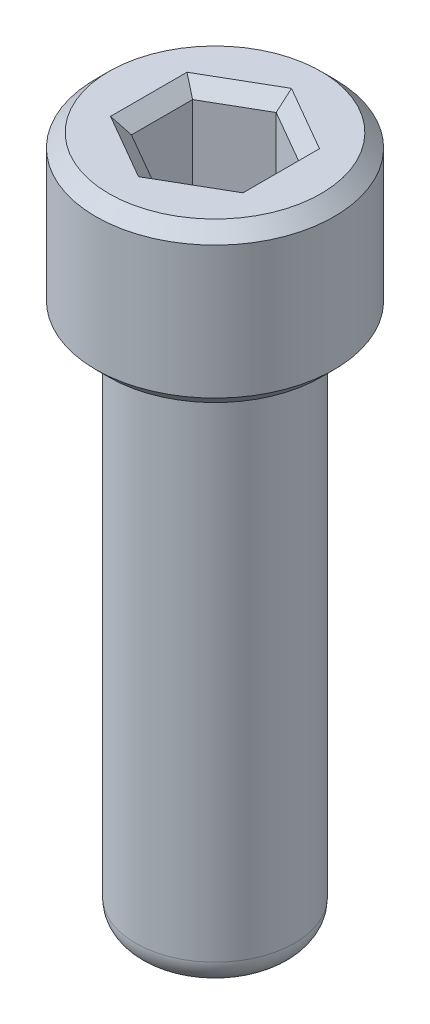
ISO-10303-21;
HEADER;
FILE_DESCRIPTION(('STEP AP214'),'2;1');
FILE_NAME('part.step','',(''),(''),'','','');
FILE_SCHEMA(('AUTOMOTIVE_DESIGN { 1 0 10303 214 1 1 1 1 }'));
ENDSEC;
DATA;
#1=APPLICATION_CONTEXT('core data for automotive mechanical design processes');
#2=APPLICATION_PROTOCOL_DEFINITION('international standard','automotive_design',2000,#1);
#3=PRODUCT_CONTEXT('',#1,'mechanical');
#4=PRODUCT('Part','Part','',(#3));
#5=PRODUCT_RELATED_PRODUCT_CATEGORY('part','',(#4));
#6=PRODUCT_DEFINITION_FORMATION('','',#4);
#7=PRODUCT_DEFINITION_CONTEXT('part definition',#1,'design');
#8=PRODUCT_DEFINITION('design','',#6,#7);
#9=PRODUCT_DEFINITION_SHAPE('','',#8);
#10=(LENGTH_UNIT() NAMED_UNIT(*) SI_UNIT(.MILLI.,.METRE.));
#11=(NAMED_UNIT(*) PLANE_ANGLE_UNIT() SI_UNIT($,.RADIAN.));
#12=(NAMED_UNIT(*) SI_UNIT($,.STERADIAN.) SOLID_ANGLE_UNIT());
#13=UNCERTAINTY_MEASURE_WITH_UNIT(LENGTH_MEASURE(1.E-05),#10,'distance_accuracy_value','');
#14=(GEOMETRIC_REPRESENTATION_CONTEXT(3) GLOBAL_UNCERTAINTY_ASSIGNED_CONTEXT((#13)) GLOBAL_UNIT_ASSIGNED_CONTEXT((#10,
#11,#12)) REPRESENTATION_CONTEXT('',''));
#15=CARTESIAN_POINT('',(0.,0.,0.));
#16=DIRECTION('',(0.,0.,1.));
#17=DIRECTION('',(1.,0.,0.));
#18=AXIS2_PLACEMENT_3D('',#15,#16,#17);
#19=CARTESIAN_POINT('',(0.,10.,0.));
#20=DIRECTION('',(0.,-1.,0.));
#21=DIRECTION('',(0.,0.,-1.));
#22=AXIS2_PLACEMENT_3D('',#19,#20,#21);
#23=CYLINDRICAL_SURFACE('',#22,1.5);
#24=CARTESIAN_POINT('',(0.,0.5,0.));
#25=DIRECTION('',(0.,1.,0.));
#26=DIRECTION('',(0.,0.,1.));
#27=AXIS2_PLACEMENT_3D('',#24,#25,#26);
#28=CIRCLE('',#27,1.5);
#29=CARTESIAN_POINT('',(0.,0.5,1.5));
#30=VERTEX_POINT('',#29);
#31=EDGE_CURVE('E58',#30,#30,#28,.T.);
#32=ORIENTED_EDGE('',*,*,#31,.T.);
#33=EDGE_LOOP('',(#32));
#34=FACE_BOUND('',#33,.T.);
#35=CARTESIAN_POINT('',(0.,10.,0.));
#36=DIRECTION('',(0.,1.,0.));
#37=DIRECTION('',(0.,0.,1.));
#38=AXIS2_PLACEMENT_3D('',#35,#36,#37);
#39=CIRCLE('',#38,1.5);
#40=CARTESIAN_POINT('',(0.,10.,1.5));
#41=VERTEX_POINT('',#40);
#42=EDGE_CURVE('E171',#41,#41,#39,.T.);
#43=ORIENTED_EDGE('',*,*,#42,.F.);
#44=EDGE_LOOP('',(#43));
#45=FACE_BOUND('',#44,.T.);
#46=ADVANCED_FACE('F49',(#34,#45),#23,.T.);
#47=CARTESIAN_POINT('',(0.,0.,0.));
#48=DIRECTION('',(0.,1.,0.));
#49=DIRECTION('',(0.,0.,1.));
#50=AXIS2_PLACEMENT_3D('',#47,#48,#49);
#51=PLANE('',#50);
#52=CARTESIAN_POINT('',(0.,0.,0.));
#53=DIRECTION('',(0.,1.,0.));
#54=DIRECTION('',(0.,0.,1.));
#55=AXIS2_PLACEMENT_3D('',#52,#53,#54);
#56=CIRCLE('',#55,1.);
#57=CARTESIAN_POINT('',(0.,0.,1.));
#58=VERTEX_POINT('',#57);
#59=EDGE_CURVE('E11',#58,#58,#56,.F.);
#60=ORIENTED_EDGE('',*,*,#59,.T.);
#61=EDGE_LOOP('',(#60));
#62=FACE_BOUND('',#61,.T.);
#63=ADVANCED_FACE('F272',(#62),#51,.F.);
#64=CARTESIAN_POINT('',(0.,13.,0.));
#65=DIRECTION('',(0.,-1.,0.));
#66=DIRECTION('',(0.,0.,-1.));
#67=AXIS2_PLACEMENT_3D('',#64,#65,#66);
#68=CYLINDRICAL_SURFACE('',#67,2.25);
#69=CARTESIAN_POINT('',(0.,10.25,0.));
#70=DIRECTION('',(0.,1.,0.));
#71=DIRECTION('',(0.,0.,1.));
#72=AXIS2_PLACEMENT_3D('',#69,#70,#71);
#73=CIRCLE('',#72,2.25);
#74=CARTESIAN_POINT('',(0.,10.25,2.25));
#75=VERTEX_POINT('',#74);
#76=EDGE_CURVE('E191',#75,#75,#73,.T.);
#77=ORIENTED_EDGE('',*,*,#76,.T.);
#78=EDGE_LOOP('',(#77));
#79=FACE_BOUND('',#78,.T.);
#80=CARTESIAN_POINT('',(0.,12.75,0.));
#81=DIRECTION('',(0.,1.,0.));
#82=DIRECTION('',(0.,0.,1.));
#83=AXIS2_PLACEMENT_3D('',#80,#81,#82);
#84=CIRCLE('',#83,2.25);
#85=CARTESIAN_POINT('',(0.,12.75,2.25));
#86=VERTEX_POINT('',#85);
#87=EDGE_CURVE('E187',#86,#86,#84,.F.);
#88=ORIENTED_EDGE('',*,*,#87,.T.);
#89=EDGE_LOOP('',(#88));
#90=FACE_BOUND('',#89,.T.);
#91=ADVANCED_FACE('F276',(#79,#90),#68,.T.);
#92=CARTESIAN_POINT('',(0.,13.,0.));
#93=DIRECTION('',(0.,1.,0.));
#94=DIRECTION('',(0.,0.,1.));
#95=AXIS2_PLACEMENT_3D('',#92,#93,#94);
#96=PLANE('',#95);
#97=CARTESIAN_POINT('',(0.,13.,0.));
#98=DIRECTION('',(0.,1.,0.));
#99=DIRECTION('',(0.,0.,1.));
#100=AXIS2_PLACEMENT_3D('',#97,#98,#99);
#101=CIRCLE('',#100,2.);
#102=CARTESIAN_POINT('',(0.,13.,2.));
#103=VERTEX_POINT('',#102);
#104=EDGE_CURVE('E218',#103,#103,#101,.T.);
#105=ORIENTED_EDGE('',*,*,#104,.T.);
#106=EDGE_LOOP('',(#105));
#107=FACE_BOUND('',#106,.T.);
#108=DIRECTION('',(-0.866025403784439,0.,0.5));
#109=VECTOR('',#108,1.);
#110=CARTESIAN_POINT('',(0.124999999999999,13.,1.37120688932536));
#111=LINE('',#110,#109);
#112=CARTESIAN_POINT('',(1.25,13.,0.721687836487032));
#113=VERTEX_POINT('',#112);
#114=CARTESIAN_POINT('',(0.,13.,1.44337567297406));
#115=VERTEX_POINT('',#114);
#116=EDGE_CURVE('E199',#113,#115,#111,.T.);
#117=ORIENTED_EDGE('',*,*,#116,.T.);
#118=DIRECTION('',(-0.866025403784439,0.,-0.5));
#119=VECTOR('',#118,1.);
#120=CARTESIAN_POINT('',(-1.125,13.,0.793856620135735));
#121=LINE('',#120,#119);
#122=CARTESIAN_POINT('',(-1.25,13.,0.721687836487032));
#123=VERTEX_POINT('',#122);
#124=EDGE_CURVE('E214',#115,#123,#121,.T.);
#125=ORIENTED_EDGE('',*,*,#124,.T.);
#126=DIRECTION('',(0.,0.,-1.));
#127=VECTOR('',#126,1.);
#128=CARTESIAN_POINT('',(-1.25,13.,-0.577350269189626));
#129=LINE('',#128,#127);
#130=CARTESIAN_POINT('',(-1.25,13.,-0.721687836487033));
#131=VERTEX_POINT('',#130);
#132=EDGE_CURVE('E211',#123,#131,#129,.T.);
#133=ORIENTED_EDGE('',*,*,#132,.T.);
#134=DIRECTION('',(0.866025403784439,0.,-0.5));
#135=VECTOR('',#134,1.);
#136=CARTESIAN_POINT('',(-0.125,13.,-1.37120688932536));
#137=LINE('',#136,#135);
#138=CARTESIAN_POINT('',(0.,13.,-1.44337567297406));
#139=VERTEX_POINT('',#138);
#140=EDGE_CURVE('E208',#131,#139,#137,.T.);
#141=ORIENTED_EDGE('',*,*,#140,.T.);
#142=DIRECTION('',(0.866025403784439,0.,0.5));
#143=VECTOR('',#142,1.);
#144=CARTESIAN_POINT('',(1.125,13.,-0.793856620135736));
#145=LINE('',#144,#143);
#146=CARTESIAN_POINT('',(1.25,13.,-0.721687836487033));
#147=VERTEX_POINT('',#146);
#148=EDGE_CURVE('E205',#139,#147,#145,.T.);
#149=ORIENTED_EDGE('',*,*,#148,.T.);
#150=DIRECTION('',(0.,0.,1.));
#151=VECTOR('',#150,1.);
#152=CARTESIAN_POINT('',(1.25,13.,0.577350269189625));
#153=LINE('',#152,#151);
#154=EDGE_CURVE('E202',#147,#113,#153,.T.);
#155=ORIENTED_EDGE('',*,*,#154,.T.);
#156=EDGE_LOOP('',(#117,#125,#133,#141,#149,#155));
#157=FACE_BOUND('',#156,.T.);
#158=ADVANCED_FACE('F338',(#107,#157),#96,.T.);
#159=CARTESIAN_POINT('',(0.,10.,0.));
#160=DIRECTION('',(0.,1.,0.));
#161=DIRECTION('',(0.,0.,1.));
#162=AXIS2_PLACEMENT_3D('',#159,#160,#161);
#163=PLANE('',#162);
#164=CARTESIAN_POINT('',(0.,10.,0.));
#165=DIRECTION('',(0.,1.,0.));
#166=DIRECTION('',(0.,0.,1.));
#167=AXIS2_PLACEMENT_3D('',#164,#165,#166);
#168=CIRCLE('',#167,2.);
#169=CARTESIAN_POINT('',(0.,10.,2.));
#170=VERTEX_POINT('',#169);
#171=EDGE_CURVE('E195',#170,#170,#168,.F.);
#172=ORIENTED_EDGE('',*,*,#171,.T.);
#173=EDGE_LOOP('',(#172));
#174=FACE_BOUND('',#173,.T.);
#175=ORIENTED_EDGE('',*,*,#42,.T.);
#176=EDGE_LOOP('',(#175));
#177=FACE_BOUND('',#176,.T.);
#178=ADVANCED_FACE('F372',(#174,#177),#163,.F.);
#179=CARTESIAN_POINT('',(1.,11.,-0.577350269189627));
#180=DIRECTION('',(0.5,0.,-0.866025403784439));
#181=DIRECTION('',(-0.866025403784439,0.,-0.5));
#182=AXIS2_PLACEMENT_3D('',#179,#180,#181);
#183=PLANE('',#182);
#184=DIRECTION('',(0.,1.,0.));
#185=VECTOR('',#184,1.);
#186=CARTESIAN_POINT('',(1.,11.,-0.577350269189627));
#187=LINE('',#186,#185);
#188=CARTESIAN_POINT('',(1.,11.,-0.577350269189627));
#189=VERTEX_POINT('',#188);
#190=CARTESIAN_POINT('',(1.,12.75,-0.577350269189627));
#191=VERTEX_POINT('',#190);
#192=EDGE_CURVE('E168',#189,#191,#187,.T.);
#193=ORIENTED_EDGE('',*,*,#192,.T.);
#194=DIRECTION('',(-0.866025403784439,0.,-0.5));
#195=VECTOR('',#194,1.);
#196=CARTESIAN_POINT('',(0.,12.75,-1.15470053837925));
#197=LINE('',#196,#195);
#198=CARTESIAN_POINT('',(0.,12.75,-1.15470053837925));
#199=VERTEX_POINT('',#198);
#200=EDGE_CURVE('E129',#191,#199,#197,.T.);
#201=ORIENTED_EDGE('',*,*,#200,.T.);
#202=DIRECTION('',(0.,1.,0.));
#203=VECTOR('',#202,1.);
#204=CARTESIAN_POINT('',(0.,11.,-1.15470053837925));
#205=LINE('',#204,#203);
#206=CARTESIAN_POINT('',(0.,11.,-1.15470053837925));
#207=VERTEX_POINT('',#206);
#208=EDGE_CURVE('E122',#207,#199,#205,.T.);
#209=ORIENTED_EDGE('',*,*,#208,.F.);
#210=DIRECTION('',(-0.866025403784439,0.,-0.5));
#211=VECTOR('',#210,1.);
#212=CARTESIAN_POINT('',(1.,11.,-0.577350269189627));
#213=LINE('',#212,#211);
#214=EDGE_CURVE('E126',#189,#207,#213,.T.);
#215=ORIENTED_EDGE('',*,*,#214,.F.);
#216=EDGE_LOOP('',(#193,#201,#209,#215));
#217=FACE_BOUND('',#216,.T.);
#218=ADVANCED_FACE('F124',(#217),#183,.F.);
#219=CARTESIAN_POINT('',(1.,11.,0.577350269189625));
#220=DIRECTION('',(1.,0.,0.));
#221=DIRECTION('',(0.,0.,-1.));
#222=AXIS2_PLACEMENT_3D('',#219,#220,#221);
#223=PLANE('',#222);
#224=DIRECTION('',(0.,1.,0.));
#225=VECTOR('',#224,1.);
#226=CARTESIAN_POINT('',(1.,11.,0.577350269189625));
#227=LINE('',#226,#225);
#228=CARTESIAN_POINT('',(1.,11.,0.577350269189625));
#229=VERTEX_POINT('',#228);
#230=CARTESIAN_POINT('',(1.,12.75,0.577350269189625));
#231=VERTEX_POINT('',#230);
#232=EDGE_CURVE('E172',#229,#231,#227,.T.);
#233=ORIENTED_EDGE('',*,*,#232,.T.);
#234=DIRECTION('',(0.,0.,-1.));
#235=VECTOR('',#234,1.);
#236=CARTESIAN_POINT('',(1.,12.75,-0.577350269189627));
#237=LINE('',#236,#235);
#238=EDGE_CURVE('E72',#231,#191,#237,.T.);
#239=ORIENTED_EDGE('',*,*,#238,.T.);
#240=ORIENTED_EDGE('',*,*,#192,.F.);
#241=DIRECTION('',(0.,0.,-1.));
#242=VECTOR('',#241,1.);
#243=CARTESIAN_POINT('',(1.,11.,0.577350269189625));
#244=LINE('',#243,#242);
#245=EDGE_CURVE('E134',#229,#189,#244,.T.);
#246=ORIENTED_EDGE('',*,*,#245,.F.);
#247=EDGE_LOOP('',(#233,#239,#240,#246));
#248=FACE_BOUND('',#247,.T.);
#249=ADVANCED_FACE('F353',(#248),#223,.F.);
#250=CARTESIAN_POINT('',(0.,11.,1.15470053837925));
#251=DIRECTION('',(0.5,0.,0.866025403784439));
#252=DIRECTION('',(0.866025403784439,0.,-0.5));
#253=AXIS2_PLACEMENT_3D('',#250,#251,#252);
#254=PLANE('',#253);
#255=DIRECTION('',(0.,1.,0.));
#256=VECTOR('',#255,1.);
#257=CARTESIAN_POINT('',(0.,11.,1.15470053837925));
#258=LINE('',#257,#256);
#259=CARTESIAN_POINT('',(0.,11.,1.15470053837925));
#260=VERTEX_POINT('',#259);
#261=CARTESIAN_POINT('',(0.,12.75,1.15470053837925));
#262=VERTEX_POINT('',#261);
#263=EDGE_CURVE('E175',#260,#262,#258,.T.);
#264=ORIENTED_EDGE('',*,*,#263,.T.);
#265=DIRECTION('',(0.866025403784439,0.,-0.5));
#266=VECTOR('',#265,1.);
#267=CARTESIAN_POINT('',(1.,12.75,0.577350269189625));
#268=LINE('',#267,#266);
#269=EDGE_CURVE('E65',#262,#231,#268,.T.);
#270=ORIENTED_EDGE('',*,*,#269,.T.);
#271=ORIENTED_EDGE('',*,*,#232,.F.);
#272=DIRECTION('',(0.866025403784439,0.,-0.5));
#273=VECTOR('',#272,1.);
#274=CARTESIAN_POINT('',(0.,11.,1.15470053837925));
#275=LINE('',#274,#273);
#276=EDGE_CURVE('E163',#260,#229,#275,.T.);
#277=ORIENTED_EDGE('',*,*,#276,.F.);
#278=EDGE_LOOP('',(#264,#270,#271,#277));
#279=FACE_BOUND('',#278,.T.);
#280=ADVANCED_FACE('F355',(#279),#254,.F.);
#281=CARTESIAN_POINT('',(-1.,11.,0.577350269189626));
#282=DIRECTION('',(-0.5,0.,0.866025403784439));
#283=DIRECTION('',(0.866025403784439,0.,0.5));
#284=AXIS2_PLACEMENT_3D('',#281,#282,#283);
#285=PLANE('',#284);
#286=DIRECTION('',(0.,1.,0.));
#287=VECTOR('',#286,1.);
#288=CARTESIAN_POINT('',(-1.,11.,0.577350269189626));
#289=LINE('',#288,#287);
#290=CARTESIAN_POINT('',(-1.,11.,0.577350269189626));
#291=VERTEX_POINT('',#290);
#292=CARTESIAN_POINT('',(-1.,12.75,0.577350269189626));
#293=VERTEX_POINT('',#292);
#294=EDGE_CURVE('E178',#291,#293,#289,.T.);
#295=ORIENTED_EDGE('',*,*,#294,.T.);
#296=DIRECTION('',(0.866025403784439,0.,0.5));
#297=VECTOR('',#296,1.);
#298=CARTESIAN_POINT('',(0.,12.75,1.15470053837925));
#299=LINE('',#298,#297);
#300=EDGE_CURVE('E222',#293,#262,#299,.T.);
#301=ORIENTED_EDGE('',*,*,#300,.T.);
#302=ORIENTED_EDGE('',*,*,#263,.F.);
#303=DIRECTION('',(0.866025403784439,0.,0.5));
#304=VECTOR('',#303,1.);
#305=CARTESIAN_POINT('',(-1.,11.,0.577350269189626));
#306=LINE('',#305,#304);
#307=EDGE_CURVE('E159',#291,#260,#306,.T.);
#308=ORIENTED_EDGE('',*,*,#307,.F.);
#309=EDGE_LOOP('',(#295,#301,#302,#308));
#310=FACE_BOUND('',#309,.T.);
#311=ADVANCED_FACE('F351',(#310),#285,.F.);
#312=CARTESIAN_POINT('',(-1.,11.,-0.577350269189626));
#313=DIRECTION('',(-1.,0.,0.));
#314=DIRECTION('',(0.,0.,1.));
#315=AXIS2_PLACEMENT_3D('',#312,#313,#314);
#316=PLANE('',#315);
#317=DIRECTION('',(0.,1.,0.));
#318=VECTOR('',#317,1.);
#319=CARTESIAN_POINT('',(-1.,11.,-0.577350269189626));
#320=LINE('',#319,#318);
#321=CARTESIAN_POINT('',(-1.,11.,-0.577350269189626));
#322=VERTEX_POINT('',#321);
#323=CARTESIAN_POINT('',(-1.,12.75,-0.577350269189626));
#324=VERTEX_POINT('',#323);
#325=EDGE_CURVE('E133',#322,#324,#320,.T.);
#326=ORIENTED_EDGE('',*,*,#325,.T.);
#327=DIRECTION('',(0.,0.,1.));
#328=VECTOR('',#327,1.);
#329=CARTESIAN_POINT('',(-1.,12.75,0.577350269189626));
#330=LINE('',#329,#328);
#331=EDGE_CURVE('E226',#324,#293,#330,.T.);
#332=ORIENTED_EDGE('',*,*,#331,.T.);
#333=ORIENTED_EDGE('',*,*,#294,.F.);
#334=DIRECTION('',(0.,0.,1.));
#335=VECTOR('',#334,1.);
#336=CARTESIAN_POINT('',(-1.,11.,-0.577350269189626));
#337=LINE('',#336,#335);
#338=EDGE_CURVE('E144',#322,#291,#337,.T.);
#339=ORIENTED_EDGE('',*,*,#338,.F.);
#340=EDGE_LOOP('',(#326,#332,#333,#339));
#341=FACE_BOUND('',#340,.T.);
#342=ADVANCED_FACE('F348',(#341),#316,.F.);
#343=CARTESIAN_POINT('',(0.,11.,-1.15470053837925));
#344=DIRECTION('',(-0.5,0.,-0.866025403784439));
#345=DIRECTION('',(-0.866025403784439,0.,0.5));
#346=AXIS2_PLACEMENT_3D('',#343,#344,#345);
#347=PLANE('',#346);
#348=ORIENTED_EDGE('',*,*,#208,.T.);
#349=DIRECTION('',(-0.866025403784439,0.,0.5));
#350=VECTOR('',#349,1.);
#351=CARTESIAN_POINT('',(-1.,12.75,-0.577350269189626));
#352=LINE('',#351,#350);
#353=EDGE_CURVE('E229',#199,#324,#352,.T.);
#354=ORIENTED_EDGE('',*,*,#353,.T.);
#355=ORIENTED_EDGE('',*,*,#325,.F.);
#356=DIRECTION('',(-0.866025403784439,0.,0.5));
#357=VECTOR('',#356,1.);
#358=CARTESIAN_POINT('',(0.,11.,-1.15470053837925));
#359=LINE('',#358,#357);
#360=EDGE_CURVE('E137',#207,#322,#359,.T.);
#361=ORIENTED_EDGE('',*,*,#360,.F.);
#362=EDGE_LOOP('',(#348,#354,#355,#361));
#363=FACE_BOUND('',#362,.T.);
#364=ADVANCED_FACE('F138',(#363),#347,.F.);
#365=CARTESIAN_POINT('',(0.,11.,0.));
#366=DIRECTION('',(0.,1.,0.));
#367=DIRECTION('',(0.,0.,1.));
#368=AXIS2_PLACEMENT_3D('',#365,#366,#367);
#369=PLANE('',#368);
#370=ORIENTED_EDGE('',*,*,#214,.T.);
#371=ORIENTED_EDGE('',*,*,#360,.T.);
#372=ORIENTED_EDGE('',*,*,#338,.T.);
#373=ORIENTED_EDGE('',*,*,#307,.T.);
#374=ORIENTED_EDGE('',*,*,#276,.T.);
#375=ORIENTED_EDGE('',*,*,#245,.T.);
#376=EDGE_LOOP('',(#370,#371,#372,#373,#374,#375));
#377=FACE_BOUND('',#376,.T.);
#378=ADVANCED_FACE('F146',(#377),#369,.T.);
#379=CARTESIAN_POINT('',(0.,10.25,0.));
#380=DIRECTION('',(0.,1.,0.));
#381=DIRECTION('',(0.,0.,1.));
#382=AXIS2_PLACEMENT_3D('',#379,#380,#381);
#383=CONICAL_SURFACE('',#382,2.25,0.785398163397454);
#384=ORIENTED_EDGE('',*,*,#171,.F.);
#385=EDGE_LOOP('',(#384));
#386=FACE_BOUND('',#385,.T.);
#387=ORIENTED_EDGE('',*,*,#76,.F.);
#388=EDGE_LOOP('',(#387));
#389=FACE_BOUND('',#388,.T.);
#390=ADVANCED_FACE('F282',(#386,#389),#383,.T.);
#391=CARTESIAN_POINT('',(0.,13.,0.));
#392=DIRECTION('',(0.,-1.,0.));
#393=DIRECTION('',(0.,0.,-1.));
#394=AXIS2_PLACEMENT_3D('',#391,#392,#393);
#395=CONICAL_SURFACE('',#394,2.,0.785398163397447);
#396=ORIENTED_EDGE('',*,*,#87,.F.);
#397=EDGE_LOOP('',(#396));
#398=FACE_BOUND('',#397,.T.);
#399=ORIENTED_EDGE('',*,*,#104,.F.);
#400=EDGE_LOOP('',(#399));
#401=FACE_BOUND('',#400,.T.);
#402=ADVANCED_FACE('F288',(#398,#401),#395,.T.);
#403=CARTESIAN_POINT('',(1.,12.75,-0.577350269189627));
#404=DIRECTION('',(-0.353553390593272,0.707106781186551,0.612372435695791));
#405=DIRECTION('',(0.866025403784439,0.,0.5));
#406=AXIS2_PLACEMENT_3D('',#403,#404,#405);
#407=PLANE('',#406);
#408=DIRECTION('',(-0.65465367070798,-0.654653670707973,0.377964473009229));
#409=VECTOR('',#408,1.);
#410=CARTESIAN_POINT('',(1.,12.75,-0.577350269189627));
#411=LINE('',#410,#409);
#412=EDGE_CURVE('E154',#147,#191,#411,.T.);
#413=ORIENTED_EDGE('',*,*,#412,.F.);
#414=ORIENTED_EDGE('',*,*,#148,.F.);
#415=DIRECTION('',(0.,-0.654653670707973,0.755928946018458));
#416=VECTOR('',#415,1.);
#417=CARTESIAN_POINT('',(0.,12.75,-1.15470053837925));
#418=LINE('',#417,#416);
#419=EDGE_CURVE('E150',#199,#139,#418,.F.);
#420=ORIENTED_EDGE('',*,*,#419,.F.);
#421=ORIENTED_EDGE('',*,*,#200,.F.);
#422=EDGE_LOOP('',(#413,#414,#420,#421));
#423=FACE_BOUND('',#422,.T.);
#424=ADVANCED_FACE('F294',(#423),#407,.T.);
#425=CARTESIAN_POINT('',(0.,12.75,-1.15470053837925));
#426=DIRECTION('',(0.353553390593272,0.707106781186552,0.612372435695791));
#427=DIRECTION('',(0.866025403784439,0.,-0.5));
#428=AXIS2_PLACEMENT_3D('',#425,#426,#427);
#429=PLANE('',#428);
#430=ORIENTED_EDGE('',*,*,#419,.T.);
#431=ORIENTED_EDGE('',*,*,#140,.F.);
#432=DIRECTION('',(0.65465367070798,-0.654653670707973,0.37796447300923));
#433=VECTOR('',#432,1.);
#434=CARTESIAN_POINT('',(-1.,12.75,-0.577350269189626));
#435=LINE('',#434,#433);
#436=EDGE_CURVE('E248',#324,#131,#435,.F.);
#437=ORIENTED_EDGE('',*,*,#436,.F.);
#438=ORIENTED_EDGE('',*,*,#353,.F.);
#439=EDGE_LOOP('',(#430,#431,#437,#438));
#440=FACE_BOUND('',#439,.T.);
#441=ADVANCED_FACE('F320',(#440),#429,.T.);
#442=CARTESIAN_POINT('',(1.,12.75,0.577350269189625));
#443=DIRECTION('',(-0.707106781186544,0.707106781186551,0.));
#444=DIRECTION('',(0.,0.,1.));
#445=AXIS2_PLACEMENT_3D('',#442,#443,#444);
#446=PLANE('',#445);
#447=ORIENTED_EDGE('',*,*,#412,.T.);
#448=ORIENTED_EDGE('',*,*,#238,.F.);
#449=DIRECTION('',(-0.65465367070798,-0.654653670707973,-0.37796447300923));
#450=VECTOR('',#449,1.);
#451=CARTESIAN_POINT('',(1.,12.75,0.577350269189625));
#452=LINE('',#451,#450);
#453=EDGE_CURVE('E244',#113,#231,#452,.T.);
#454=ORIENTED_EDGE('',*,*,#453,.F.);
#455=ORIENTED_EDGE('',*,*,#154,.F.);
#456=EDGE_LOOP('',(#447,#448,#454,#455));
#457=FACE_BOUND('',#456,.T.);
#458=ADVANCED_FACE('F313',(#457),#446,.T.);
#459=CARTESIAN_POINT('',(-1.,12.75,-0.577350269189626));
#460=DIRECTION('',(0.707106781186544,0.707106781186551,0.));
#461=DIRECTION('',(0.,0.,-1.));
#462=AXIS2_PLACEMENT_3D('',#459,#460,#461);
#463=PLANE('',#462);
#464=ORIENTED_EDGE('',*,*,#436,.T.);
#465=ORIENTED_EDGE('',*,*,#132,.F.);
#466=DIRECTION('',(0.65465367070798,-0.654653670707973,-0.377964473009229));
#467=VECTOR('',#466,1.);
#468=CARTESIAN_POINT('',(-1.,12.75,0.577350269189626));
#469=LINE('',#468,#467);
#470=EDGE_CURVE('E241',#293,#123,#469,.F.);
#471=ORIENTED_EDGE('',*,*,#470,.F.);
#472=ORIENTED_EDGE('',*,*,#331,.F.);
#473=EDGE_LOOP('',(#464,#465,#471,#472));
#474=FACE_BOUND('',#473,.T.);
#475=ADVANCED_FACE('F306',(#474),#463,.T.);
#476=CARTESIAN_POINT('',(0.,12.75,1.15470053837925));
#477=DIRECTION('',(-0.353553390593272,0.707106781186552,-0.612372435695791));
#478=DIRECTION('',(-0.866025403784439,0.,0.5));
#479=AXIS2_PLACEMENT_3D('',#476,#477,#478);
#480=PLANE('',#479);
#481=ORIENTED_EDGE('',*,*,#453,.T.);
#482=ORIENTED_EDGE('',*,*,#269,.F.);
#483=DIRECTION('',(0.,0.654653670707973,0.755928946018458));
#484=VECTOR('',#483,1.);
#485=CARTESIAN_POINT('',(0.,12.4642857142857,0.824786098842319));
#486=LINE('',#485,#484);
#487=EDGE_CURVE('E238',#115,#262,#486,.F.);
#488=ORIENTED_EDGE('',*,*,#487,.F.);
#489=ORIENTED_EDGE('',*,*,#116,.F.);
#490=EDGE_LOOP('',(#481,#482,#488,#489));
#491=FACE_BOUND('',#490,.T.);
#492=ADVANCED_FACE('F267',(#491),#480,.T.);
#493=CARTESIAN_POINT('',(-1.,12.75,0.577350269189626));
#494=DIRECTION('',(0.353553390593272,0.707106781186551,-0.612372435695791));
#495=DIRECTION('',(-0.866025403784439,0.,-0.5));
#496=AXIS2_PLACEMENT_3D('',#493,#494,#495);
#497=PLANE('',#496);
#498=ORIENTED_EDGE('',*,*,#470,.T.);
#499=ORIENTED_EDGE('',*,*,#124,.F.);
#500=ORIENTED_EDGE('',*,*,#487,.T.);
#501=ORIENTED_EDGE('',*,*,#300,.F.);
#502=EDGE_LOOP('',(#498,#499,#500,#501));
#503=FACE_BOUND('',#502,.T.);
#504=ADVANCED_FACE('F261',(#503),#497,.T.);
#505=CARTESIAN_POINT('',(0.,0.5,0.));
#506=DIRECTION('',(0.,1.,0.));
#507=DIRECTION('',(0.,0.,1.));
#508=AXIS2_PLACEMENT_3D('',#505,#506,#507);
#509=TOROIDAL_SURFACE('',#508,1.,0.5);
#510=ORIENTED_EDGE('',*,*,#59,.F.);
#511=EDGE_LOOP('',(#510));
#512=FACE_BOUND('',#511,.T.);
#513=ORIENTED_EDGE('',*,*,#31,.F.);
#514=EDGE_LOOP('',(#513));
#515=FACE_BOUND('',#514,.T.);
#516=ADVANCED_FACE('F51',(#512,#515),#509,.T.);
#517=CLOSED_SHELL('',(#46,#63,#91,#158,#178,#218,#249,#280,#311,#342,#364,#378,#390,#402,#424,
#441,#458,#475,#492,#504,#516));
#518=MANIFOLD_SOLID_BREP('B2',#517);
#519=ADVANCED_BREP_SHAPE_REPRESENTATION('',(#18,#518),#14);
#520=SHAPE_DEFINITION_REPRESENTATION(#9,#519);
ENDSEC;
END-ISO-10303-21;
